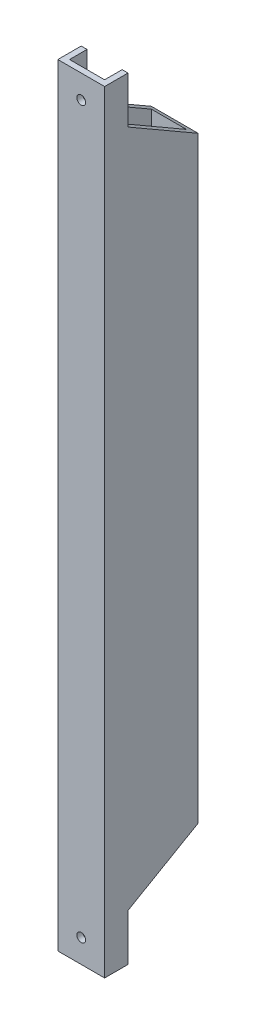
ISO-10303-21;
HEADER;
FILE_DESCRIPTION(('STEP AP214'),'2;1');
FILE_NAME('part.step','',(''),(''),'','','');
FILE_SCHEMA(('AUTOMOTIVE_DESIGN { 1 0 10303 214 1 1 1 1 }'));
ENDSEC;
DATA;
#1=APPLICATION_CONTEXT('core data for automotive mechanical design processes');
#2=APPLICATION_PROTOCOL_DEFINITION('international standard','automotive_design',2000,#1);
#3=PRODUCT_CONTEXT('',#1,'mechanical');
#4=PRODUCT('Part','Part','',(#3));
#5=PRODUCT_RELATED_PRODUCT_CATEGORY('part','',(#4));
#6=PRODUCT_DEFINITION_FORMATION('','',#4);
#7=PRODUCT_DEFINITION_CONTEXT('part definition',#1,'design');
#8=PRODUCT_DEFINITION('design','',#6,#7);
#9=PRODUCT_DEFINITION_SHAPE('','',#8);
#10=(LENGTH_UNIT() NAMED_UNIT(*) SI_UNIT(.MILLI.,.METRE.));
#11=(NAMED_UNIT(*) PLANE_ANGLE_UNIT() SI_UNIT($,.RADIAN.));
#12=(NAMED_UNIT(*) SI_UNIT($,.STERADIAN.) SOLID_ANGLE_UNIT());
#13=UNCERTAINTY_MEASURE_WITH_UNIT(LENGTH_MEASURE(1.E-05),#10,'distance_accuracy_value','');
#14=(GEOMETRIC_REPRESENTATION_CONTEXT(3) GLOBAL_UNCERTAINTY_ASSIGNED_CONTEXT((#13)) GLOBAL_UNIT_ASSIGNED_CONTEXT((#10,
#11,#12)) REPRESENTATION_CONTEXT('',''));
#15=CARTESIAN_POINT('',(0.,0.,0.));
#16=DIRECTION('',(0.,0.,1.));
#17=DIRECTION('',(1.,0.,0.));
#18=AXIS2_PLACEMENT_3D('',#15,#16,#17);
#19=CARTESIAN_POINT('',(0.,0.,0.));
#20=DIRECTION('',(0.,-1.,0.));
#21=DIRECTION('',(0.,0.,-1.));
#22=AXIS2_PLACEMENT_3D('',#19,#20,#21);
#23=PLANE('',#22);
#24=DIRECTION('',(0.,0.,1.));
#25=VECTOR('',#24,1.);
#26=CARTESIAN_POINT('',(0.,0.,0.));
#27=LINE('',#26,#25);
#28=CARTESIAN_POINT('',(0.,0.,-12.7));
#29=VERTEX_POINT('',#28);
#30=CARTESIAN_POINT('',(0.,0.,0.));
#31=VERTEX_POINT('',#30);
#32=EDGE_CURVE('E222',#29,#31,#27,.T.);
#33=ORIENTED_EDGE('',*,*,#32,.F.);
#34=DIRECTION('',(1.,0.,0.));
#35=VECTOR('',#34,1.);
#36=CARTESIAN_POINT('',(0.,0.,-12.7));
#37=LINE('',#36,#35);
#38=CARTESIAN_POINT('',(3.175,0.,-12.7));
#39=VERTEX_POINT('',#38);
#40=EDGE_CURVE('E245',#29,#39,#37,.T.);
#41=ORIENTED_EDGE('',*,*,#40,.T.);
#42=DIRECTION('',(0.,0.,1.));
#43=VECTOR('',#42,1.);
#44=CARTESIAN_POINT('',(3.175,0.,-3.175));
#45=LINE('',#44,#43);
#46=CARTESIAN_POINT('',(3.175,0.,-3.175));
#47=VERTEX_POINT('',#46);
#48=EDGE_CURVE('E290',#39,#47,#45,.T.);
#49=ORIENTED_EDGE('',*,*,#48,.T.);
#50=DIRECTION('',(1.,0.,0.));
#51=VECTOR('',#50,1.);
#52=CARTESIAN_POINT('',(3.175,0.,-3.175));
#53=LINE('',#52,#51);
#54=CARTESIAN_POINT('',(22.225,0.,-3.175));
#55=VERTEX_POINT('',#54);
#56=EDGE_CURVE('E193',#47,#55,#53,.T.);
#57=ORIENTED_EDGE('',*,*,#56,.T.);
#58=DIRECTION('',(0.,0.,-1.));
#59=VECTOR('',#58,1.);
#60=CARTESIAN_POINT('',(22.225,0.,-3.175));
#61=LINE('',#60,#59);
#62=CARTESIAN_POINT('',(22.225,0.,-12.7));
#63=VERTEX_POINT('',#62);
#64=EDGE_CURVE('E242',#55,#63,#61,.T.);
#65=ORIENTED_EDGE('',*,*,#64,.T.);
#66=CARTESIAN_POINT('',(25.4,0.,-12.7));
#67=VERTEX_POINT('',#66);
#68=EDGE_CURVE('E240',#63,#67,#37,.T.);
#69=ORIENTED_EDGE('',*,*,#68,.T.);
#70=DIRECTION('',(0.,0.,-1.));
#71=VECTOR('',#70,1.);
#72=CARTESIAN_POINT('',(25.4,0.,0.));
#73=LINE('',#72,#71);
#74=CARTESIAN_POINT('',(25.4,0.,0.));
#75=VERTEX_POINT('',#74);
#76=EDGE_CURVE('E181',#75,#67,#73,.T.);
#77=ORIENTED_EDGE('',*,*,#76,.F.);
#78=DIRECTION('',(1.,0.,0.));
#79=VECTOR('',#78,1.);
#80=CARTESIAN_POINT('',(0.,0.,0.));
#81=LINE('',#80,#79);
#82=EDGE_CURVE('E226',#31,#75,#81,.T.);
#83=ORIENTED_EDGE('',*,*,#82,.F.);
#84=EDGE_LOOP('',(#33,#41,#49,#57,#65,#69,#77,#83));
#85=FACE_BOUND('',#84,.T.);
#86=ADVANCED_FACE('F33',(#85),#23,.T.);
#87=CARTESIAN_POINT('',(0.,419.1,0.));
#88=DIRECTION('',(1.,0.,0.));
#89=DIRECTION('',(0.,0.,-1.));
#90=AXIS2_PLACEMENT_3D('',#87,#88,#89);
#91=PLANE('',#90);
#92=DIRECTION('',(0.,1.,0.));
#93=VECTOR('',#92,1.);
#94=CARTESIAN_POINT('',(0.,0.,-12.7));
#95=LINE('',#94,#93);
#96=CARTESIAN_POINT('',(0.,25.4,-12.7));
#97=VERTEX_POINT('',#96);
#98=EDGE_CURVE('E156',#29,#97,#95,.T.);
#99=ORIENTED_EDGE('',*,*,#98,.F.);
#100=ORIENTED_EDGE('',*,*,#32,.T.);
#101=DIRECTION('',(0.,-1.,0.));
#102=VECTOR('',#101,1.);
#103=CARTESIAN_POINT('',(0.,419.1,0.));
#104=LINE('',#103,#102);
#105=CARTESIAN_POINT('',(0.,419.1,0.));
#106=VERTEX_POINT('',#105);
#107=EDGE_CURVE('E186',#106,#31,#104,.T.);
#108=ORIENTED_EDGE('',*,*,#107,.F.);
#109=DIRECTION('',(0.,0.,1.));
#110=VECTOR('',#109,1.);
#111=CARTESIAN_POINT('',(0.,419.1,0.));
#112=LINE('',#111,#110);
#113=CARTESIAN_POINT('',(0.,419.1,-12.7));
#114=VERTEX_POINT('',#113);
#115=EDGE_CURVE('E223',#114,#106,#112,.T.);
#116=ORIENTED_EDGE('',*,*,#115,.F.);
#117=DIRECTION('',(0.,-1.,0.));
#118=VECTOR('',#117,1.);
#119=CARTESIAN_POINT('',(0.,419.1,-12.7));
#120=LINE('',#119,#118);
#121=CARTESIAN_POINT('',(0.,393.7,-12.7));
#122=VERTEX_POINT('',#121);
#123=EDGE_CURVE('E259',#114,#122,#120,.T.);
#124=ORIENTED_EDGE('',*,*,#123,.T.);
#125=DIRECTION('',(0.,-0.499999999999998,-0.86602540378444));
#126=VECTOR('',#125,1.);
#127=CARTESIAN_POINT('',(0.,393.7,-12.7));
#128=LINE('',#127,#126);
#129=CARTESIAN_POINT('',(0.,371.702954743875,-50.8));
#130=VERTEX_POINT('',#129);
#131=EDGE_CURVE('E172',#122,#130,#128,.T.);
#132=ORIENTED_EDGE('',*,*,#131,.T.);
#133=DIRECTION('',(0.,-1.,0.));
#134=VECTOR('',#133,1.);
#135=CARTESIAN_POINT('',(0.,419.1,-50.8));
#136=LINE('',#135,#134);
#137=CARTESIAN_POINT('',(0.,47.3970452561246,-50.8));
#138=VERTEX_POINT('',#137);
#139=EDGE_CURVE('E164',#130,#138,#136,.T.);
#140=ORIENTED_EDGE('',*,*,#139,.T.);
#141=DIRECTION('',(0.,0.499999999999998,-0.86602540378444));
#142=VECTOR('',#141,1.);
#143=CARTESIAN_POINT('',(0.,25.4,-12.7));
#144=LINE('',#143,#142);
#145=EDGE_CURVE('E145',#97,#138,#144,.T.);
#146=ORIENTED_EDGE('',*,*,#145,.F.);
#147=EDGE_LOOP('',(#99,#100,#108,#116,#124,#132,#140,#146));
#148=FACE_BOUND('',#147,.T.);
#149=ADVANCED_FACE('F35',(#148),#91,.F.);
#150=CARTESIAN_POINT('',(25.4,419.1,0.));
#151=DIRECTION('',(-1.,0.,0.));
#152=DIRECTION('',(0.,0.,1.));
#153=AXIS2_PLACEMENT_3D('',#150,#151,#152);
#154=PLANE('',#153);
#155=DIRECTION('',(0.,1.,0.));
#156=VECTOR('',#155,1.);
#157=CARTESIAN_POINT('',(25.4,0.,-12.7));
#158=LINE('',#157,#156);
#159=CARTESIAN_POINT('',(25.4,25.4,-12.7));
#160=VERTEX_POINT('',#159);
#161=EDGE_CURVE('E157',#67,#160,#158,.T.);
#162=ORIENTED_EDGE('',*,*,#161,.T.);
#163=DIRECTION('',(0.,0.499999999999998,-0.86602540378444));
#164=VECTOR('',#163,1.);
#165=CARTESIAN_POINT('',(25.4,25.4,-12.7));
#166=LINE('',#165,#164);
#167=CARTESIAN_POINT('',(25.4,47.3970452561246,-50.8));
#168=VERTEX_POINT('',#167);
#169=EDGE_CURVE('E312',#160,#168,#166,.T.);
#170=ORIENTED_EDGE('',*,*,#169,.T.);
#171=DIRECTION('',(0.,-1.,0.));
#172=VECTOR('',#171,1.);
#173=CARTESIAN_POINT('',(25.4,419.1,-50.8));
#174=LINE('',#173,#172);
#175=CARTESIAN_POINT('',(25.4,371.702954743875,-50.8));
#176=VERTEX_POINT('',#175);
#177=EDGE_CURVE('E166',#176,#168,#174,.T.);
#178=ORIENTED_EDGE('',*,*,#177,.F.);
#179=DIRECTION('',(0.,-0.499999999999998,-0.86602540378444));
#180=VECTOR('',#179,1.);
#181=CARTESIAN_POINT('',(25.4,393.7,-12.7));
#182=LINE('',#181,#180);
#183=CARTESIAN_POINT('',(25.4,393.7,-12.7));
#184=VERTEX_POINT('',#183);
#185=EDGE_CURVE('E261',#184,#176,#182,.T.);
#186=ORIENTED_EDGE('',*,*,#185,.F.);
#187=DIRECTION('',(0.,-1.,0.));
#188=VECTOR('',#187,1.);
#189=CARTESIAN_POINT('',(25.4,419.1,-12.7));
#190=LINE('',#189,#188);
#191=CARTESIAN_POINT('',(25.4,419.1,-12.7));
#192=VERTEX_POINT('',#191);
#193=EDGE_CURVE('E258',#192,#184,#190,.T.);
#194=ORIENTED_EDGE('',*,*,#193,.F.);
#195=DIRECTION('',(0.,0.,-1.));
#196=VECTOR('',#195,1.);
#197=CARTESIAN_POINT('',(25.4,419.1,0.));
#198=LINE('',#197,#196);
#199=CARTESIAN_POINT('',(25.4,419.1,0.));
#200=VERTEX_POINT('',#199);
#201=EDGE_CURVE('E173',#200,#192,#198,.T.);
#202=ORIENTED_EDGE('',*,*,#201,.F.);
#203=DIRECTION('',(0.,-1.,0.));
#204=VECTOR('',#203,1.);
#205=CARTESIAN_POINT('',(25.4,419.1,0.));
#206=LINE('',#205,#204);
#207=EDGE_CURVE('E175',#200,#75,#206,.T.);
#208=ORIENTED_EDGE('',*,*,#207,.T.);
#209=ORIENTED_EDGE('',*,*,#76,.T.);
#210=EDGE_LOOP('',(#162,#170,#178,#186,#194,#202,#208,#209));
#211=FACE_BOUND('',#210,.T.);
#212=ADVANCED_FACE('F234',(#211),#154,.F.);
#213=CARTESIAN_POINT('',(0.,419.1,-50.8));
#214=DIRECTION('',(0.,0.,1.));
#215=DIRECTION('',(1.,0.,0.));
#216=AXIS2_PLACEMENT_3D('',#213,#214,#215);
#217=PLANE('',#216);
#218=CARTESIAN_POINT('',(12.7,297.8275,-50.8));
#219=DIRECTION('',(0.,0.,-1.));
#220=DIRECTION('',(-1.,0.,0.));
#221=AXIS2_PLACEMENT_3D('',#218,#219,#220);
#222=CIRCLE('',#221,2.1828125);
#223=CARTESIAN_POINT('',(10.5171875,297.8275,-50.8));
#224=VERTEX_POINT('',#223);
#225=EDGE_CURVE('E321',#224,#224,#222,.T.);
#226=ORIENTED_EDGE('',*,*,#225,.F.);
#227=EDGE_LOOP('',(#226));
#228=FACE_BOUND('',#227,.T.);
#229=CARTESIAN_POINT('',(12.7,121.2725,-50.8));
#230=DIRECTION('',(0.,0.,-1.));
#231=DIRECTION('',(-1.,0.,0.));
#232=AXIS2_PLACEMENT_3D('',#229,#230,#231);
#233=CIRCLE('',#232,2.1828125);
#234=CARTESIAN_POINT('',(10.5171875,121.2725,-50.8));
#235=VERTEX_POINT('',#234);
#236=EDGE_CURVE('E313',#235,#235,#233,.T.);
#237=ORIENTED_EDGE('',*,*,#236,.F.);
#238=EDGE_LOOP('',(#237));
#239=FACE_BOUND('',#238,.T.);
#240=DIRECTION('',(1.,0.,0.));
#241=VECTOR('',#240,1.);
#242=CARTESIAN_POINT('',(0.,47.3970452561246,-50.8));
#243=LINE('',#242,#241);
#244=EDGE_CURVE('E149',#138,#168,#243,.T.);
#245=ORIENTED_EDGE('',*,*,#244,.F.);
#246=ORIENTED_EDGE('',*,*,#139,.F.);
#247=DIRECTION('',(1.,0.,0.));
#248=VECTOR('',#247,1.);
#249=CARTESIAN_POINT('',(0.,371.702954743875,-50.8));
#250=LINE('',#249,#248);
#251=EDGE_CURVE('E267',#130,#176,#250,.T.);
#252=ORIENTED_EDGE('',*,*,#251,.T.);
#253=ORIENTED_EDGE('',*,*,#177,.T.);
#254=EDGE_LOOP('',(#245,#246,#252,#253));
#255=FACE_BOUND('',#254,.T.);
#256=ADVANCED_FACE('F162',(#228,#239,#255),#217,.F.);
#257=CARTESIAN_POINT('',(22.225,419.1,-3.175));
#258=DIRECTION('',(-1.,0.,0.));
#259=DIRECTION('',(0.,0.,1.));
#260=AXIS2_PLACEMENT_3D('',#257,#258,#259);
#261=PLANE('',#260);
#262=DIRECTION('',(0.,-0.499999999999998,0.86602540378444));
#263=VECTOR('',#262,1.);
#264=CARTESIAN_POINT('',(22.225,119.700554014476,-176.033350734966));
#265=LINE('',#264,#263);
#266=CARTESIAN_POINT('',(22.225,45.5639581514476,-47.625));
#267=VERTEX_POINT('',#266);
#268=CARTESIAN_POINT('',(22.225,25.4,-12.7));
#269=VERTEX_POINT('',#268);
#270=EDGE_CURVE('E253',#267,#269,#265,.T.);
#271=ORIENTED_EDGE('',*,*,#270,.T.);
#272=DIRECTION('',(0.,-1.,0.));
#273=VECTOR('',#272,1.);
#274=CARTESIAN_POINT('',(22.225,419.1,-12.7000000000001));
#275=LINE('',#274,#273);
#276=EDGE_CURVE('E256',#269,#63,#275,.T.);
#277=ORIENTED_EDGE('',*,*,#276,.T.);
#278=ORIENTED_EDGE('',*,*,#64,.F.);
#279=DIRECTION('',(0.,-1.,0.));
#280=VECTOR('',#279,1.);
#281=CARTESIAN_POINT('',(22.225,419.1,-3.175));
#282=LINE('',#281,#280);
#283=CARTESIAN_POINT('',(22.225,419.1,-3.175));
#284=VERTEX_POINT('',#283);
#285=EDGE_CURVE('E213',#284,#55,#282,.T.);
#286=ORIENTED_EDGE('',*,*,#285,.F.);
#287=DIRECTION('',(0.,0.,-1.));
#288=VECTOR('',#287,1.);
#289=CARTESIAN_POINT('',(22.225,419.1,-3.175));
#290=LINE('',#289,#288);
#291=CARTESIAN_POINT('',(22.225,419.1,-12.7));
#292=VERTEX_POINT('',#291);
#293=EDGE_CURVE('E289',#284,#292,#290,.T.);
#294=ORIENTED_EDGE('',*,*,#293,.T.);
#295=DIRECTION('',(0.,1.,0.));
#296=VECTOR('',#295,1.);
#297=CARTESIAN_POINT('',(22.225,419.1,-12.7));
#298=LINE('',#297,#296);
#299=CARTESIAN_POINT('',(22.225,393.7,-12.7));
#300=VERTEX_POINT('',#299);
#301=EDGE_CURVE('E269',#300,#292,#298,.T.);
#302=ORIENTED_EDGE('',*,*,#301,.F.);
#303=DIRECTION('',(0.,0.499999999999998,0.86602540378444));
#304=VECTOR('',#303,1.);
#305=CARTESIAN_POINT('',(22.225,404.174445985523,5.44227262806235));
#306=LINE('',#305,#304);
#307=CARTESIAN_POINT('',(22.225,373.536041848552,-47.625));
#308=VERTEX_POINT('',#307);
#309=EDGE_CURVE('E277',#308,#300,#306,.T.);
#310=ORIENTED_EDGE('',*,*,#309,.F.);
#311=DIRECTION('',(0.,-1.,0.));
#312=VECTOR('',#311,1.);
#313=CARTESIAN_POINT('',(22.225,419.1,-47.625));
#314=LINE('',#313,#312);
#315=EDGE_CURVE('E210',#308,#267,#314,.T.);
#316=ORIENTED_EDGE('',*,*,#315,.T.);
#317=EDGE_LOOP('',(#271,#277,#278,#286,#294,#302,#310,#316));
#318=FACE_BOUND('',#317,.T.);
#319=ADVANCED_FACE('F308',(#318),#261,.T.);
#320=CARTESIAN_POINT('',(3.175,419.1,-47.625));
#321=DIRECTION('',(0.,0.,1.));
#322=DIRECTION('',(1.,0.,0.));
#323=AXIS2_PLACEMENT_3D('',#320,#321,#322);
#324=PLANE('',#323);
#325=CARTESIAN_POINT('',(12.7,297.8275,-47.625));
#326=DIRECTION('',(0.,0.,1.));
#327=DIRECTION('',(1.,0.,0.));
#328=AXIS2_PLACEMENT_3D('',#325,#326,#327);
#329=CIRCLE('',#328,2.1828125);
#330=CARTESIAN_POINT('',(14.8828125,297.8275,-47.625));
#331=VERTEX_POINT('',#330);
#332=EDGE_CURVE('E324',#331,#331,#329,.F.);
#333=ORIENTED_EDGE('',*,*,#332,.T.);
#334=EDGE_LOOP('',(#333));
#335=FACE_BOUND('',#334,.T.);
#336=CARTESIAN_POINT('',(12.7,121.2725,-47.625));
#337=DIRECTION('',(0.,0.,1.));
#338=DIRECTION('',(1.,0.,0.));
#339=AXIS2_PLACEMENT_3D('',#336,#337,#338);
#340=CIRCLE('',#339,2.1828125);
#341=CARTESIAN_POINT('',(14.8828125,121.2725,-47.625));
#342=VERTEX_POINT('',#341);
#343=EDGE_CURVE('E315',#342,#342,#340,.F.);
#344=ORIENTED_EDGE('',*,*,#343,.T.);
#345=EDGE_LOOP('',(#344));
#346=FACE_BOUND('',#345,.T.);
#347=DIRECTION('',(0.,-1.,0.));
#348=VECTOR('',#347,1.);
#349=CARTESIAN_POINT('',(3.175,419.1,-47.625));
#350=LINE('',#349,#348);
#351=CARTESIAN_POINT('',(3.175,373.536041848552,-47.625));
#352=VERTEX_POINT('',#351);
#353=CARTESIAN_POINT('',(3.175,45.5639581514475,-47.625));
#354=VERTEX_POINT('',#353);
#355=EDGE_CURVE('E203',#352,#354,#350,.T.);
#356=ORIENTED_EDGE('',*,*,#355,.T.);
#357=DIRECTION('',(1.,0.,0.));
#358=VECTOR('',#357,1.);
#359=CARTESIAN_POINT('',(3.17499999999996,45.5639581514476,-47.625));
#360=LINE('',#359,#358);
#361=EDGE_CURVE('E48',#354,#267,#360,.T.);
#362=ORIENTED_EDGE('',*,*,#361,.T.);
#363=ORIENTED_EDGE('',*,*,#315,.F.);
#364=DIRECTION('',(1.,0.,0.));
#365=VECTOR('',#364,1.);
#366=CARTESIAN_POINT('',(3.17500000000001,373.536041848552,-47.625));
#367=LINE('',#366,#365);
#368=EDGE_CURVE('E209',#352,#308,#367,.T.);
#369=ORIENTED_EDGE('',*,*,#368,.F.);
#370=EDGE_LOOP('',(#356,#362,#363,#369));
#371=FACE_BOUND('',#370,.T.);
#372=ADVANCED_FACE('F206',(#335,#346,#371),#324,.T.);
#373=CARTESIAN_POINT('',(3.175,419.1,-3.175));
#374=DIRECTION('',(1.,0.,0.));
#375=DIRECTION('',(0.,0.,-1.));
#376=AXIS2_PLACEMENT_3D('',#373,#374,#375);
#377=PLANE('',#376);
#378=ORIENTED_EDGE('',*,*,#48,.F.);
#379=DIRECTION('',(0.,1.,0.));
#380=VECTOR('',#379,1.);
#381=CARTESIAN_POINT('',(3.175,419.1,-12.7000000000001));
#382=LINE('',#381,#380);
#383=CARTESIAN_POINT('',(3.175,25.4,-12.7));
#384=VERTEX_POINT('',#383);
#385=EDGE_CURVE('E11',#39,#384,#382,.T.);
#386=ORIENTED_EDGE('',*,*,#385,.T.);
#387=DIRECTION('',(0.,0.499999999999998,-0.86602540378444));
#388=VECTOR('',#387,1.);
#389=CARTESIAN_POINT('',(3.175,119.700554014476,-176.033350734966));
#390=LINE('',#389,#388);
#391=EDGE_CURVE('E41',#384,#354,#390,.T.);
#392=ORIENTED_EDGE('',*,*,#391,.T.);
#393=ORIENTED_EDGE('',*,*,#355,.F.);
#394=DIRECTION('',(0.,-0.499999999999998,-0.86602540378444));
#395=VECTOR('',#394,1.);
#396=CARTESIAN_POINT('',(3.175,404.174445985523,5.44227262806235));
#397=LINE('',#396,#395);
#398=CARTESIAN_POINT('',(3.175,393.7,-12.7));
#399=VERTEX_POINT('',#398);
#400=EDGE_CURVE('E196',#399,#352,#397,.T.);
#401=ORIENTED_EDGE('',*,*,#400,.F.);
#402=DIRECTION('',(0.,-1.,0.));
#403=VECTOR('',#402,1.);
#404=CARTESIAN_POINT('',(3.175,419.1,-12.7));
#405=LINE('',#404,#403);
#406=CARTESIAN_POINT('',(3.175,419.1,-12.7));
#407=VERTEX_POINT('',#406);
#408=EDGE_CURVE('E189',#407,#399,#405,.T.);
#409=ORIENTED_EDGE('',*,*,#408,.F.);
#410=DIRECTION('',(0.,0.,1.));
#411=VECTOR('',#410,1.);
#412=CARTESIAN_POINT('',(3.175,419.1,-3.175));
#413=LINE('',#412,#411);
#414=CARTESIAN_POINT('',(3.175,419.1,-3.175));
#415=VERTEX_POINT('',#414);
#416=EDGE_CURVE('E216',#407,#415,#413,.T.);
#417=ORIENTED_EDGE('',*,*,#416,.T.);
#418=DIRECTION('',(0.,-1.,0.));
#419=VECTOR('',#418,1.);
#420=CARTESIAN_POINT('',(3.175,419.1,-3.175));
#421=LINE('',#420,#419);
#422=EDGE_CURVE('E211',#415,#47,#421,.T.);
#423=ORIENTED_EDGE('',*,*,#422,.T.);
#424=EDGE_LOOP('',(#378,#386,#392,#393,#401,#409,#417,#423));
#425=FACE_BOUND('',#424,.T.);
#426=ADVANCED_FACE('F201',(#425),#377,.T.);
#427=CARTESIAN_POINT('',(0.,419.1,0.));
#428=DIRECTION('',(0.,-1.,0.));
#429=DIRECTION('',(0.,0.,-1.));
#430=AXIS2_PLACEMENT_3D('',#427,#428,#429);
#431=PLANE('',#430);
#432=ORIENTED_EDGE('',*,*,#201,.T.);
#433=DIRECTION('',(1.,0.,0.));
#434=VECTOR('',#433,1.);
#435=CARTESIAN_POINT('',(0.,419.1,-12.7));
#436=LINE('',#435,#434);
#437=EDGE_CURVE('E263',#292,#192,#436,.T.);
#438=ORIENTED_EDGE('',*,*,#437,.F.);
#439=ORIENTED_EDGE('',*,*,#293,.F.);
#440=DIRECTION('',(1.,0.,0.));
#441=VECTOR('',#440,1.);
#442=CARTESIAN_POINT('',(3.175,419.1,-3.175));
#443=LINE('',#442,#441);
#444=EDGE_CURVE('E287',#415,#284,#443,.T.);
#445=ORIENTED_EDGE('',*,*,#444,.F.);
#446=ORIENTED_EDGE('',*,*,#416,.F.);
#447=EDGE_CURVE('E56',#114,#407,#436,.T.);
#448=ORIENTED_EDGE('',*,*,#447,.F.);
#449=ORIENTED_EDGE('',*,*,#115,.T.);
#450=DIRECTION('',(1.,0.,0.));
#451=VECTOR('',#450,1.);
#452=CARTESIAN_POINT('',(0.,419.1,0.));
#453=LINE('',#452,#451);
#454=EDGE_CURVE('E178',#106,#200,#453,.T.);
#455=ORIENTED_EDGE('',*,*,#454,.T.);
#456=EDGE_LOOP('',(#432,#438,#439,#445,#446,#448,#449,#455));
#457=FACE_BOUND('',#456,.T.);
#458=ADVANCED_FACE('F303',(#457),#431,.F.);
#459=CARTESIAN_POINT('',(0.,419.1,0.));
#460=DIRECTION('',(0.,0.,-1.));
#461=DIRECTION('',(-1.,0.,0.));
#462=AXIS2_PLACEMENT_3D('',#459,#460,#461);
#463=PLANE('',#462);
#464=CARTESIAN_POINT('',(12.7,406.4,0.));
#465=DIRECTION('',(0.,0.,-1.));
#466=DIRECTION('',(-1.,0.,0.));
#467=AXIS2_PLACEMENT_3D('',#464,#465,#466);
#468=CIRCLE('',#467,2.38124999999999);
#469=CARTESIAN_POINT('',(10.31875,406.4,0.));
#470=VERTEX_POINT('',#469);
#471=EDGE_CURVE('E279',#470,#470,#468,.T.);
#472=ORIENTED_EDGE('',*,*,#471,.T.);
#473=EDGE_LOOP('',(#472));
#474=FACE_BOUND('',#473,.T.);
#475=CARTESIAN_POINT('',(12.7,12.7,0.));
#476=DIRECTION('',(0.,0.,-1.));
#477=DIRECTION('',(-1.,0.,0.));
#478=AXIS2_PLACEMENT_3D('',#475,#476,#477);
#479=CIRCLE('',#478,2.38124999999999);
#480=CARTESIAN_POINT('',(10.31875,12.7,0.));
#481=VERTEX_POINT('',#480);
#482=EDGE_CURVE('E194',#481,#481,#479,.T.);
#483=ORIENTED_EDGE('',*,*,#482,.T.);
#484=EDGE_LOOP('',(#483));
#485=FACE_BOUND('',#484,.T.);
#486=ORIENTED_EDGE('',*,*,#82,.T.);
#487=ORIENTED_EDGE('',*,*,#207,.F.);
#488=ORIENTED_EDGE('',*,*,#454,.F.);
#489=ORIENTED_EDGE('',*,*,#107,.T.);
#490=EDGE_LOOP('',(#486,#487,#488,#489));
#491=FACE_BOUND('',#490,.T.);
#492=ADVANCED_FACE('F362',(#474,#485,#491),#463,.F.);
#493=CARTESIAN_POINT('',(3.175,419.1,-3.175));
#494=DIRECTION('',(0.,0.,-1.));
#495=DIRECTION('',(-1.,0.,0.));
#496=AXIS2_PLACEMENT_3D('',#493,#494,#495);
#497=PLANE('',#496);
#498=CARTESIAN_POINT('',(12.7,406.4,-3.175));
#499=DIRECTION('',(0.,0.,-1.));
#500=DIRECTION('',(-1.,0.,0.));
#501=AXIS2_PLACEMENT_3D('',#498,#499,#500);
#502=CIRCLE('',#501,2.38124999999999);
#503=CARTESIAN_POINT('',(10.31875,406.4,-3.175));
#504=VERTEX_POINT('',#503);
#505=EDGE_CURVE('E282',#504,#504,#502,.T.);
#506=ORIENTED_EDGE('',*,*,#505,.F.);
#507=EDGE_LOOP('',(#506));
#508=FACE_BOUND('',#507,.T.);
#509=CARTESIAN_POINT('',(12.7,12.7,-3.175));
#510=DIRECTION('',(0.,0.,-1.));
#511=DIRECTION('',(-1.,0.,0.));
#512=AXIS2_PLACEMENT_3D('',#509,#510,#511);
#513=CIRCLE('',#512,2.38124999999999);
#514=CARTESIAN_POINT('',(10.31875,12.7,-3.175));
#515=VERTEX_POINT('',#514);
#516=EDGE_CURVE('E190',#515,#515,#513,.T.);
#517=ORIENTED_EDGE('',*,*,#516,.F.);
#518=EDGE_LOOP('',(#517));
#519=FACE_BOUND('',#518,.T.);
#520=ORIENTED_EDGE('',*,*,#56,.F.);
#521=ORIENTED_EDGE('',*,*,#422,.F.);
#522=ORIENTED_EDGE('',*,*,#444,.T.);
#523=ORIENTED_EDGE('',*,*,#285,.T.);
#524=EDGE_LOOP('',(#520,#521,#522,#523));
#525=FACE_BOUND('',#524,.T.);
#526=ADVANCED_FACE('F298',(#508,#519,#525),#497,.T.);
#527=CARTESIAN_POINT('',(12.7,12.7,-50.8));
#528=DIRECTION('',(0.,0.,-1.));
#529=DIRECTION('',(-1.,0.,0.));
#530=AXIS2_PLACEMENT_3D('',#527,#528,#529);
#531=CYLINDRICAL_SURFACE('',#530,2.38124999999999);
#532=ORIENTED_EDGE('',*,*,#516,.T.);
#533=EDGE_LOOP('',(#532));
#534=FACE_BOUND('',#533,.T.);
#535=ORIENTED_EDGE('',*,*,#482,.F.);
#536=EDGE_LOOP('',(#535));
#537=FACE_BOUND('',#536,.T.);
#538=ADVANCED_FACE('F368',(#534,#537),#531,.F.);
#539=CARTESIAN_POINT('',(12.7,406.4,-50.8));
#540=DIRECTION('',(0.,0.,-1.));
#541=DIRECTION('',(-1.,0.,0.));
#542=AXIS2_PLACEMENT_3D('',#539,#540,#541);
#543=CYLINDRICAL_SURFACE('',#542,2.38124999999999);
#544=ORIENTED_EDGE('',*,*,#505,.T.);
#545=EDGE_LOOP('',(#544));
#546=FACE_BOUND('',#545,.T.);
#547=ORIENTED_EDGE('',*,*,#471,.F.);
#548=EDGE_LOOP('',(#547));
#549=FACE_BOUND('',#548,.T.);
#550=ADVANCED_FACE('F376',(#546,#549),#543,.F.);
#551=CARTESIAN_POINT('',(0.,419.1,-12.7));
#552=DIRECTION('',(0.,0.,1.));
#553=DIRECTION('',(1.,0.,0.));
#554=AXIS2_PLACEMENT_3D('',#551,#552,#553);
#555=PLANE('',#554);
#556=ORIENTED_EDGE('',*,*,#301,.T.);
#557=ORIENTED_EDGE('',*,*,#437,.T.);
#558=ORIENTED_EDGE('',*,*,#193,.T.);
#559=DIRECTION('',(1.,0.,0.));
#560=VECTOR('',#559,1.);
#561=CARTESIAN_POINT('',(0.,393.7,-12.7));
#562=LINE('',#561,#560);
#563=EDGE_CURVE('E273',#300,#184,#562,.T.);
#564=ORIENTED_EDGE('',*,*,#563,.F.);
#565=EDGE_LOOP('',(#556,#557,#558,#564));
#566=FACE_BOUND('',#565,.T.);
#567=ADVANCED_FACE('F383',(#566),#555,.F.);
#568=CARTESIAN_POINT('',(0.,393.7,-12.7));
#569=DIRECTION('',(0.,-0.86602540378444,0.499999999999998));
#570=DIRECTION('',(0.,-0.499999999999998,-0.86602540378444));
#571=AXIS2_PLACEMENT_3D('',#568,#569,#570);
#572=PLANE('',#571);
#573=ORIENTED_EDGE('',*,*,#309,.T.);
#574=ORIENTED_EDGE('',*,*,#563,.T.);
#575=ORIENTED_EDGE('',*,*,#185,.T.);
#576=ORIENTED_EDGE('',*,*,#251,.F.);
#577=ORIENTED_EDGE('',*,*,#131,.F.);
#578=EDGE_CURVE('E270',#122,#399,#562,.T.);
#579=ORIENTED_EDGE('',*,*,#578,.T.);
#580=ORIENTED_EDGE('',*,*,#400,.T.);
#581=ORIENTED_EDGE('',*,*,#368,.T.);
#582=EDGE_LOOP('',(#573,#574,#575,#576,#577,#579,#580,#581));
#583=FACE_BOUND('',#582,.T.);
#584=ADVANCED_FACE('F491',(#583),#572,.F.);
#585=ORIENTED_EDGE('',*,*,#408,.T.);
#586=ORIENTED_EDGE('',*,*,#578,.F.);
#587=ORIENTED_EDGE('',*,*,#123,.F.);
#588=ORIENTED_EDGE('',*,*,#447,.T.);
#589=EDGE_LOOP('',(#585,#586,#587,#588));
#590=FACE_BOUND('',#589,.T.);
#591=ADVANCED_FACE('F413',(#590),#555,.F.);
#592=CARTESIAN_POINT('',(0.,0.,-12.7));
#593=DIRECTION('',(0.,0.,-1.));
#594=DIRECTION('',(-1.,0.,0.));
#595=AXIS2_PLACEMENT_3D('',#592,#593,#594);
#596=PLANE('',#595);
#597=DIRECTION('',(1.,0.,0.));
#598=VECTOR('',#597,1.);
#599=CARTESIAN_POINT('',(0.,25.4,-12.7));
#600=LINE('',#599,#598);
#601=EDGE_CURVE('E167',#269,#160,#600,.T.);
#602=ORIENTED_EDGE('',*,*,#601,.T.);
#603=ORIENTED_EDGE('',*,*,#161,.F.);
#604=ORIENTED_EDGE('',*,*,#68,.F.);
#605=ORIENTED_EDGE('',*,*,#276,.F.);
#606=EDGE_LOOP('',(#602,#603,#604,#605));
#607=FACE_BOUND('',#606,.T.);
#608=ADVANCED_FACE('F311',(#607),#596,.T.);
#609=ORIENTED_EDGE('',*,*,#40,.F.);
#610=ORIENTED_EDGE('',*,*,#98,.T.);
#611=EDGE_CURVE('E152',#97,#384,#600,.T.);
#612=ORIENTED_EDGE('',*,*,#611,.T.);
#613=ORIENTED_EDGE('',*,*,#385,.F.);
#614=EDGE_LOOP('',(#609,#610,#612,#613));
#615=FACE_BOUND('',#614,.T.);
#616=ADVANCED_FACE('F348',(#615),#596,.T.);
#617=CARTESIAN_POINT('',(0.,25.4,-12.7));
#618=DIRECTION('',(0.,-0.86602540378444,-0.499999999999998));
#619=DIRECTION('',(0.,0.499999999999998,-0.86602540378444));
#620=AXIS2_PLACEMENT_3D('',#617,#618,#619);
#621=PLANE('',#620);
#622=ORIENTED_EDGE('',*,*,#361,.F.);
#623=ORIENTED_EDGE('',*,*,#391,.F.);
#624=ORIENTED_EDGE('',*,*,#611,.F.);
#625=ORIENTED_EDGE('',*,*,#145,.T.);
#626=ORIENTED_EDGE('',*,*,#244,.T.);
#627=ORIENTED_EDGE('',*,*,#169,.F.);
#628=ORIENTED_EDGE('',*,*,#601,.F.);
#629=ORIENTED_EDGE('',*,*,#270,.F.);
#630=EDGE_LOOP('',(#622,#623,#624,#625,#626,#627,#628,#629));
#631=FACE_BOUND('',#630,.T.);
#632=ADVANCED_FACE('F147',(#631),#621,.T.);
#633=CARTESIAN_POINT('',(12.7,121.2725,0.001000000000001));
#634=DIRECTION('',(0.,0.,-1.));
#635=DIRECTION('',(-1.,0.,0.));
#636=AXIS2_PLACEMENT_3D('',#633,#634,#635);
#637=CYLINDRICAL_SURFACE('',#636,2.1828125);
#638=ORIENTED_EDGE('',*,*,#343,.F.);
#639=EDGE_LOOP('',(#638));
#640=FACE_BOUND('',#639,.T.);
#641=ORIENTED_EDGE('',*,*,#236,.T.);
#642=EDGE_LOOP('',(#641));
#643=FACE_BOUND('',#642,.T.);
#644=ADVANCED_FACE('F333',(#640,#643),#637,.F.);
#645=CARTESIAN_POINT('',(12.7,297.8275,0.001000000000001));
#646=DIRECTION('',(0.,0.,-1.));
#647=DIRECTION('',(-1.,0.,0.));
#648=AXIS2_PLACEMENT_3D('',#645,#646,#647);
#649=CYLINDRICAL_SURFACE('',#648,2.1828125);
#650=ORIENTED_EDGE('',*,*,#332,.F.);
#651=EDGE_LOOP('',(#650));
#652=FACE_BOUND('',#651,.T.);
#653=ORIENTED_EDGE('',*,*,#225,.T.);
#654=EDGE_LOOP('',(#653));
#655=FACE_BOUND('',#654,.T.);
#656=ADVANCED_FACE('F330',(#652,#655),#649,.F.);
#657=CLOSED_SHELL('',(#86,#149,#212,#256,#319,#372,#426,#458,#492,#526,#538,#550,#567,#584,#591,
#608,#616,#632,#644,#656));
#658=MANIFOLD_SOLID_BREP('B2',#657);
#659=ADVANCED_BREP_SHAPE_REPRESENTATION('',(#18,#658),#14);
#660=SHAPE_DEFINITION_REPRESENTATION(#9,#659);
ENDSEC;
END-ISO-10303-21;
